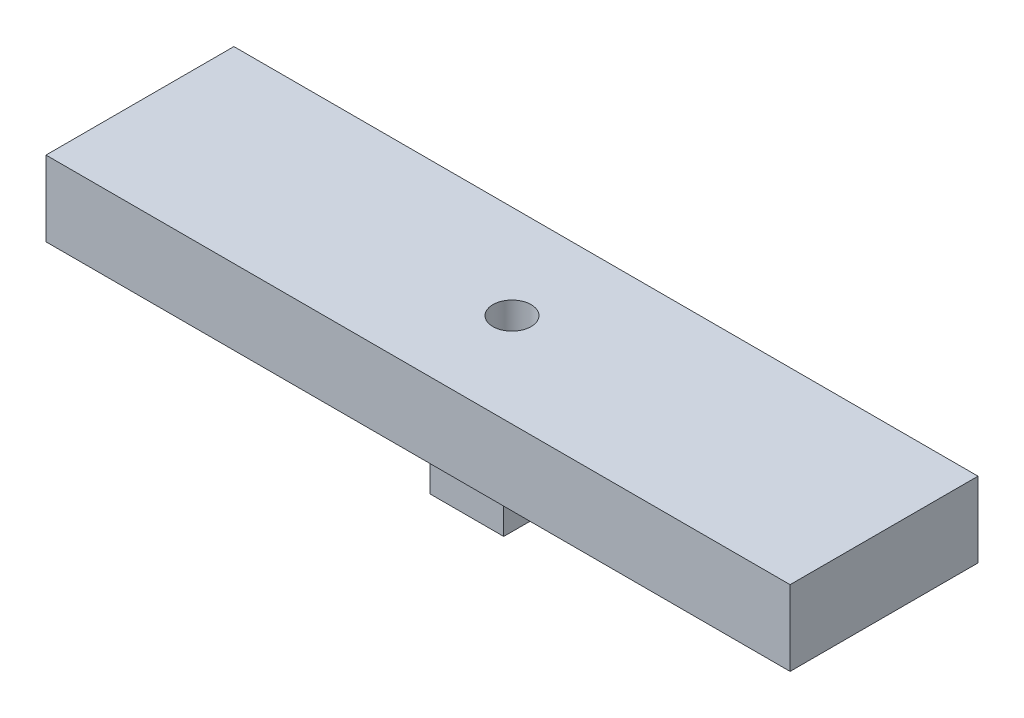
ISO-10303-21;
HEADER;
FILE_DESCRIPTION(('STEP AP214'),'2;1');
FILE_NAME('part.step','',(''),(''),'','','');
FILE_SCHEMA(('AUTOMOTIVE_DESIGN { 1 0 10303 214 1 1 1 1 }'));
ENDSEC;
DATA;
#1=APPLICATION_CONTEXT('core data for automotive mechanical design processes');
#2=APPLICATION_PROTOCOL_DEFINITION('international standard','automotive_design',2000,#1);
#3=PRODUCT_CONTEXT('',#1,'mechanical');
#4=PRODUCT('Part','Part','',(#3));
#5=PRODUCT_RELATED_PRODUCT_CATEGORY('part','',(#4));
#6=PRODUCT_DEFINITION_FORMATION('','',#4);
#7=PRODUCT_DEFINITION_CONTEXT('part definition',#1,'design');
#8=PRODUCT_DEFINITION('design','',#6,#7);
#9=PRODUCT_DEFINITION_SHAPE('','',#8);
#10=(LENGTH_UNIT() NAMED_UNIT(*) SI_UNIT(.MILLI.,.METRE.));
#11=(NAMED_UNIT(*) PLANE_ANGLE_UNIT() SI_UNIT($,.RADIAN.));
#12=(NAMED_UNIT(*) SI_UNIT($,.STERADIAN.) SOLID_ANGLE_UNIT());
#13=UNCERTAINTY_MEASURE_WITH_UNIT(LENGTH_MEASURE(1.E-05),#10,'distance_accuracy_value','');
#14=(GEOMETRIC_REPRESENTATION_CONTEXT(3) GLOBAL_UNCERTAINTY_ASSIGNED_CONTEXT((#13)) GLOBAL_UNIT_ASSIGNED_CONTEXT((#10,
#11,#12)) REPRESENTATION_CONTEXT('',''));
#15=CARTESIAN_POINT('',(0.,0.,0.));
#16=DIRECTION('',(0.,0.,1.));
#17=DIRECTION('',(1.,0.,0.));
#18=AXIS2_PLACEMENT_3D('',#15,#16,#17);
#19=CARTESIAN_POINT('',(0.,0.,0.));
#20=DIRECTION('',(0.,1.,0.));
#21=DIRECTION('',(0.,0.,1.));
#22=AXIS2_PLACEMENT_3D('',#19,#20,#21);
#23=PLANE('',#22);
#24=DIRECTION('',(1.,0.,0.));
#25=VECTOR('',#24,1.);
#26=CARTESIAN_POINT('',(-49.5,0.,12.5));
#27=LINE('',#26,#25);
#28=CARTESIAN_POINT('',(-49.5,0.,12.5));
#29=VERTEX_POINT('',#28);
#30=CARTESIAN_POINT('',(49.5,0.,12.5));
#31=VERTEX_POINT('',#30);
#32=EDGE_CURVE('E119',#29,#31,#27,.T.);
#33=ORIENTED_EDGE('',*,*,#32,.F.);
#34=DIRECTION('',(0.,0.,1.));
#35=VECTOR('',#34,1.);
#36=CARTESIAN_POINT('',(-49.5,0.,12.5));
#37=LINE('',#36,#35);
#38=CARTESIAN_POINT('',(-49.5,0.,-12.5));
#39=VERTEX_POINT('',#38);
#40=EDGE_CURVE('E132',#39,#29,#37,.T.);
#41=ORIENTED_EDGE('',*,*,#40,.F.);
#42=DIRECTION('',(-1.,0.,0.));
#43=VECTOR('',#42,1.);
#44=CARTESIAN_POINT('',(-49.5,0.,-12.5));
#45=LINE('',#44,#43);
#46=CARTESIAN_POINT('',(49.5,0.,-12.5));
#47=VERTEX_POINT('',#46);
#48=EDGE_CURVE('E140',#47,#39,#45,.T.);
#49=ORIENTED_EDGE('',*,*,#48,.F.);
#50=DIRECTION('',(0.,0.,-1.));
#51=VECTOR('',#50,1.);
#52=CARTESIAN_POINT('',(49.5,0.,12.5));
#53=LINE('',#52,#51);
#54=EDGE_CURVE('E122',#31,#47,#53,.T.);
#55=ORIENTED_EDGE('',*,*,#54,.F.);
#56=EDGE_LOOP('',(#33,#41,#49,#55));
#57=FACE_BOUND('',#56,.T.);
#58=DIRECTION('',(0.,0.,1.));
#59=VECTOR('',#58,1.);
#60=CARTESIAN_POINT('',(4.9,0.,6.));
#61=LINE('',#60,#59);
#62=CARTESIAN_POINT('',(4.9,0.,-6.));
#63=VERTEX_POINT('',#62);
#64=CARTESIAN_POINT('',(4.9,0.,6.));
#65=VERTEX_POINT('',#64);
#66=EDGE_CURVE('E118',#63,#65,#61,.T.);
#67=ORIENTED_EDGE('',*,*,#66,.F.);
#68=DIRECTION('',(1.,0.,0.));
#69=VECTOR('',#68,1.);
#70=CARTESIAN_POINT('',(-4.9,0.,-6.));
#71=LINE('',#70,#69);
#72=CARTESIAN_POINT('',(-4.9,0.,-6.));
#73=VERTEX_POINT('',#72);
#74=EDGE_CURVE('E115',#73,#63,#71,.T.);
#75=ORIENTED_EDGE('',*,*,#74,.F.);
#76=DIRECTION('',(0.,0.,-1.));
#77=VECTOR('',#76,1.);
#78=CARTESIAN_POINT('',(-4.9,0.,6.));
#79=LINE('',#78,#77);
#80=CARTESIAN_POINT('',(-4.9,0.,6.));
#81=VERTEX_POINT('',#80);
#82=EDGE_CURVE('E53',#81,#73,#79,.T.);
#83=ORIENTED_EDGE('',*,*,#82,.F.);
#84=DIRECTION('',(-1.,0.,0.));
#85=VECTOR('',#84,1.);
#86=CARTESIAN_POINT('',(-4.9,0.,6.));
#87=LINE('',#86,#85);
#88=EDGE_CURVE('E48',#65,#81,#87,.T.);
#89=ORIENTED_EDGE('',*,*,#88,.F.);
#90=EDGE_LOOP('',(#67,#75,#83,#89));
#91=FACE_BOUND('',#90,.T.);
#92=ADVANCED_FACE('F32',(#57,#91),#23,.F.);
#93=CARTESIAN_POINT('',(-49.5,10.,12.5));
#94=DIRECTION('',(0.,0.,-1.));
#95=DIRECTION('',(-1.,0.,0.));
#96=AXIS2_PLACEMENT_3D('',#93,#94,#95);
#97=PLANE('',#96);
#98=ORIENTED_EDGE('',*,*,#32,.T.);
#99=DIRECTION('',(0.,-1.,0.));
#100=VECTOR('',#99,1.);
#101=CARTESIAN_POINT('',(49.5,10.,12.5));
#102=LINE('',#101,#100);
#103=CARTESIAN_POINT('',(49.5,10.,12.5));
#104=VERTEX_POINT('',#103);
#105=EDGE_CURVE('E11',#104,#31,#102,.T.);
#106=ORIENTED_EDGE('',*,*,#105,.F.);
#107=DIRECTION('',(1.,0.,0.));
#108=VECTOR('',#107,1.);
#109=CARTESIAN_POINT('',(-49.5,10.,12.5));
#110=LINE('',#109,#108);
#111=CARTESIAN_POINT('',(-49.5,10.,12.5));
#112=VERTEX_POINT('',#111);
#113=EDGE_CURVE('E128',#112,#104,#110,.T.);
#114=ORIENTED_EDGE('',*,*,#113,.F.);
#115=DIRECTION('',(0.,-1.,0.));
#116=VECTOR('',#115,1.);
#117=CARTESIAN_POINT('',(-49.5,10.,12.5));
#118=LINE('',#117,#116);
#119=EDGE_CURVE('E137',#112,#29,#118,.T.);
#120=ORIENTED_EDGE('',*,*,#119,.T.);
#121=EDGE_LOOP('',(#98,#106,#114,#120));
#122=FACE_BOUND('',#121,.T.);
#123=ADVANCED_FACE('F34',(#122),#97,.F.);
#124=CARTESIAN_POINT('',(49.5,10.,12.5));
#125=DIRECTION('',(-1.,0.,0.));
#126=DIRECTION('',(0.,0.,1.));
#127=AXIS2_PLACEMENT_3D('',#124,#125,#126);
#128=PLANE('',#127);
#129=ORIENTED_EDGE('',*,*,#54,.T.);
#130=DIRECTION('',(0.,-1.,0.));
#131=VECTOR('',#130,1.);
#132=CARTESIAN_POINT('',(49.5,10.,-12.5));
#133=LINE('',#132,#131);
#134=CARTESIAN_POINT('',(49.5,10.,-12.5));
#135=VERTEX_POINT('',#134);
#136=EDGE_CURVE('E41',#135,#47,#133,.T.);
#137=ORIENTED_EDGE('',*,*,#136,.F.);
#138=DIRECTION('',(0.,0.,-1.));
#139=VECTOR('',#138,1.);
#140=CARTESIAN_POINT('',(49.5,10.,12.5));
#141=LINE('',#140,#139);
#142=EDGE_CURVE('E131',#104,#135,#141,.T.);
#143=ORIENTED_EDGE('',*,*,#142,.F.);
#144=ORIENTED_EDGE('',*,*,#105,.T.);
#145=EDGE_LOOP('',(#129,#137,#143,#144));
#146=FACE_BOUND('',#145,.T.);
#147=ADVANCED_FACE('F168',(#146),#128,.F.);
#148=CARTESIAN_POINT('',(-49.5,10.,-12.5));
#149=DIRECTION('',(0.,0.,1.));
#150=DIRECTION('',(1.,0.,0.));
#151=AXIS2_PLACEMENT_3D('',#148,#149,#150);
#152=PLANE('',#151);
#153=ORIENTED_EDGE('',*,*,#48,.T.);
#154=DIRECTION('',(0.,-1.,0.));
#155=VECTOR('',#154,1.);
#156=CARTESIAN_POINT('',(-49.5,10.,-12.5));
#157=LINE('',#156,#155);
#158=CARTESIAN_POINT('',(-49.5,10.,-12.5));
#159=VERTEX_POINT('',#158);
#160=EDGE_CURVE('E145',#159,#39,#157,.T.);
#161=ORIENTED_EDGE('',*,*,#160,.F.);
#162=DIRECTION('',(-1.,0.,0.));
#163=VECTOR('',#162,1.);
#164=CARTESIAN_POINT('',(-49.5,10.,-12.5));
#165=LINE('',#164,#163);
#166=EDGE_CURVE('E134',#135,#159,#165,.T.);
#167=ORIENTED_EDGE('',*,*,#166,.F.);
#168=ORIENTED_EDGE('',*,*,#136,.T.);
#169=EDGE_LOOP('',(#153,#161,#167,#168));
#170=FACE_BOUND('',#169,.T.);
#171=ADVANCED_FACE('F153',(#170),#152,.F.);
#172=CARTESIAN_POINT('',(-49.5,10.,12.5));
#173=DIRECTION('',(1.,0.,0.));
#174=DIRECTION('',(0.,0.,-1.));
#175=AXIS2_PLACEMENT_3D('',#172,#173,#174);
#176=PLANE('',#175);
#177=ORIENTED_EDGE('',*,*,#40,.T.);
#178=ORIENTED_EDGE('',*,*,#119,.F.);
#179=DIRECTION('',(0.,0.,1.));
#180=VECTOR('',#179,1.);
#181=CARTESIAN_POINT('',(-49.5,10.,12.5));
#182=LINE('',#181,#180);
#183=EDGE_CURVE('E136',#159,#112,#182,.T.);
#184=ORIENTED_EDGE('',*,*,#183,.F.);
#185=ORIENTED_EDGE('',*,*,#160,.T.);
#186=EDGE_LOOP('',(#177,#178,#184,#185));
#187=FACE_BOUND('',#186,.T.);
#188=ADVANCED_FACE('F161',(#187),#176,.F.);
#189=CARTESIAN_POINT('',(0.,10.,0.));
#190=DIRECTION('',(0.,1.,0.));
#191=DIRECTION('',(0.,0.,1.));
#192=AXIS2_PLACEMENT_3D('',#189,#190,#191);
#193=PLANE('',#192);
#194=CARTESIAN_POINT('',(0.,10.,0.));
#195=DIRECTION('',(0.,1.,0.));
#196=DIRECTION('',(0.,0.,1.));
#197=AXIS2_PLACEMENT_3D('',#194,#195,#196);
#198=CIRCLE('',#197,2.54);
#199=CARTESIAN_POINT('',(0.,10.,2.54));
#200=VERTEX_POINT('',#199);
#201=EDGE_CURVE('E195',#200,#200,#198,.T.);
#202=ORIENTED_EDGE('',*,*,#201,.F.);
#203=EDGE_LOOP('',(#202));
#204=FACE_BOUND('',#203,.T.);
#205=ORIENTED_EDGE('',*,*,#113,.T.);
#206=ORIENTED_EDGE('',*,*,#142,.T.);
#207=ORIENTED_EDGE('',*,*,#166,.T.);
#208=ORIENTED_EDGE('',*,*,#183,.T.);
#209=EDGE_LOOP('',(#205,#206,#207,#208));
#210=FACE_BOUND('',#209,.T.);
#211=ADVANCED_FACE('F167',(#204,#210),#193,.T.);
#212=CARTESIAN_POINT('',(4.9,-10.,6.));
#213=DIRECTION('',(-1.,0.,0.));
#214=DIRECTION('',(0.,0.,1.));
#215=AXIS2_PLACEMENT_3D('',#212,#213,#214);
#216=PLANE('',#215);
#217=CARTESIAN_POINT('',(4.9,-6.,0.));
#218=DIRECTION('',(1.,0.,0.));
#219=DIRECTION('',(0.,0.,-1.));
#220=AXIS2_PLACEMENT_3D('',#217,#218,#219);
#221=CIRCLE('',#220,2.05);
#222=CARTESIAN_POINT('',(4.9,-6.,-2.05));
#223=VERTEX_POINT('',#222);
#224=EDGE_CURVE('E202',#223,#223,#221,.T.);
#225=ORIENTED_EDGE('',*,*,#224,.F.);
#226=EDGE_LOOP('',(#225));
#227=FACE_BOUND('',#226,.T.);
#228=ORIENTED_EDGE('',*,*,#66,.T.);
#229=DIRECTION('',(0.,1.,0.));
#230=VECTOR('',#229,1.);
#231=CARTESIAN_POINT('',(4.9,-10.,6.));
#232=LINE('',#231,#230);
#233=CARTESIAN_POINT('',(4.9,-10.,6.));
#234=VERTEX_POINT('',#233);
#235=EDGE_CURVE('E99',#234,#65,#232,.T.);
#236=ORIENTED_EDGE('',*,*,#235,.F.);
#237=DIRECTION('',(0.,0.,1.));
#238=VECTOR('',#237,1.);
#239=CARTESIAN_POINT('',(4.9,-10.,6.));
#240=LINE('',#239,#238);
#241=CARTESIAN_POINT('',(4.9,-10.,-6.));
#242=VERTEX_POINT('',#241);
#243=EDGE_CURVE('E106',#242,#234,#240,.T.);
#244=ORIENTED_EDGE('',*,*,#243,.F.);
#245=DIRECTION('',(0.,1.,0.));
#246=VECTOR('',#245,1.);
#247=CARTESIAN_POINT('',(4.9,-10.,-6.));
#248=LINE('',#247,#246);
#249=EDGE_CURVE('E207',#242,#63,#248,.T.);
#250=ORIENTED_EDGE('',*,*,#249,.T.);
#251=EDGE_LOOP('',(#228,#236,#244,#250));
#252=FACE_BOUND('',#251,.T.);
#253=ADVANCED_FACE('F117',(#227,#252),#216,.F.);
#254=CARTESIAN_POINT('',(-4.9,-10.,6.));
#255=DIRECTION('',(0.,0.,-1.));
#256=DIRECTION('',(-1.,0.,0.));
#257=AXIS2_PLACEMENT_3D('',#254,#255,#256);
#258=PLANE('',#257);
#259=ORIENTED_EDGE('',*,*,#88,.T.);
#260=DIRECTION('',(0.,1.,0.));
#261=VECTOR('',#260,1.);
#262=CARTESIAN_POINT('',(-4.9,-10.,6.));
#263=LINE('',#262,#261);
#264=CARTESIAN_POINT('',(-4.9,-10.,6.));
#265=VERTEX_POINT('',#264);
#266=EDGE_CURVE('E102',#265,#81,#263,.T.);
#267=ORIENTED_EDGE('',*,*,#266,.F.);
#268=DIRECTION('',(-1.,0.,0.));
#269=VECTOR('',#268,1.);
#270=CARTESIAN_POINT('',(-4.9,-10.,6.));
#271=LINE('',#270,#269);
#272=EDGE_CURVE('E95',#234,#265,#271,.T.);
#273=ORIENTED_EDGE('',*,*,#272,.F.);
#274=ORIENTED_EDGE('',*,*,#235,.T.);
#275=EDGE_LOOP('',(#259,#267,#273,#274));
#276=FACE_BOUND('',#275,.T.);
#277=ADVANCED_FACE('F97',(#276),#258,.F.);
#278=CARTESIAN_POINT('',(-4.9,-10.,6.));
#279=DIRECTION('',(1.,0.,0.));
#280=DIRECTION('',(0.,0.,-1.));
#281=AXIS2_PLACEMENT_3D('',#278,#279,#280);
#282=PLANE('',#281);
#283=CARTESIAN_POINT('',(-4.9,-6.,0.));
#284=DIRECTION('',(1.,0.,0.));
#285=DIRECTION('',(0.,0.,-1.));
#286=AXIS2_PLACEMENT_3D('',#283,#284,#285);
#287=CIRCLE('',#286,2.05);
#288=CARTESIAN_POINT('',(-4.9,-6.,-2.05));
#289=VERTEX_POINT('',#288);
#290=EDGE_CURVE('E36',#289,#289,#287,.T.);
#291=ORIENTED_EDGE('',*,*,#290,.T.);
#292=EDGE_LOOP('',(#291));
#293=FACE_BOUND('',#292,.T.);
#294=ORIENTED_EDGE('',*,*,#82,.T.);
#295=DIRECTION('',(0.,1.,0.));
#296=VECTOR('',#295,1.);
#297=CARTESIAN_POINT('',(-4.9,-10.,-6.));
#298=LINE('',#297,#296);
#299=CARTESIAN_POINT('',(-4.9,-10.,-6.));
#300=VERTEX_POINT('',#299);
#301=EDGE_CURVE('E124',#300,#73,#298,.T.);
#302=ORIENTED_EDGE('',*,*,#301,.F.);
#303=DIRECTION('',(0.,0.,-1.));
#304=VECTOR('',#303,1.);
#305=CARTESIAN_POINT('',(-4.9,-10.,6.));
#306=LINE('',#305,#304);
#307=EDGE_CURVE('E105',#265,#300,#306,.T.);
#308=ORIENTED_EDGE('',*,*,#307,.F.);
#309=ORIENTED_EDGE('',*,*,#266,.T.);
#310=EDGE_LOOP('',(#294,#302,#308,#309));
#311=FACE_BOUND('',#310,.T.);
#312=ADVANCED_FACE('F218',(#293,#311),#282,.F.);
#313=CARTESIAN_POINT('',(-4.9,-10.,-6.));
#314=DIRECTION('',(0.,0.,1.));
#315=DIRECTION('',(1.,0.,0.));
#316=AXIS2_PLACEMENT_3D('',#313,#314,#315);
#317=PLANE('',#316);
#318=ORIENTED_EDGE('',*,*,#74,.T.);
#319=ORIENTED_EDGE('',*,*,#249,.F.);
#320=DIRECTION('',(1.,0.,0.));
#321=VECTOR('',#320,1.);
#322=CARTESIAN_POINT('',(-4.9,-10.,-6.));
#323=LINE('',#322,#321);
#324=EDGE_CURVE('E111',#300,#242,#323,.T.);
#325=ORIENTED_EDGE('',*,*,#324,.F.);
#326=ORIENTED_EDGE('',*,*,#301,.T.);
#327=EDGE_LOOP('',(#318,#319,#325,#326));
#328=FACE_BOUND('',#327,.T.);
#329=ADVANCED_FACE('F216',(#328),#317,.F.);
#330=CARTESIAN_POINT('',(0.,-10.,0.));
#331=DIRECTION('',(0.,-1.,0.));
#332=DIRECTION('',(0.,0.,-1.));
#333=AXIS2_PLACEMENT_3D('',#330,#331,#332);
#334=PLANE('',#333);
#335=ORIENTED_EDGE('',*,*,#243,.T.);
#336=ORIENTED_EDGE('',*,*,#272,.T.);
#337=ORIENTED_EDGE('',*,*,#307,.T.);
#338=ORIENTED_EDGE('',*,*,#324,.T.);
#339=EDGE_LOOP('',(#335,#336,#337,#338));
#340=FACE_BOUND('',#339,.T.);
#341=ADVANCED_FACE('F109',(#340),#334,.T.);
#342=CARTESIAN_POINT('',(0.,4.78,0.));
#343=DIRECTION('',(0.,1.,0.));
#344=DIRECTION('',(0.,0.,1.));
#345=AXIS2_PLACEMENT_3D('',#342,#343,#344);
#346=CYLINDRICAL_SURFACE('',#345,2.54);
#347=CARTESIAN_POINT('',(0.,4.78,0.));
#348=DIRECTION('',(0.,1.,0.));
#349=DIRECTION('',(0.,0.,1.));
#350=AXIS2_PLACEMENT_3D('',#347,#348,#349);
#351=CIRCLE('',#350,2.54);
#352=CARTESIAN_POINT('',(0.,4.78,2.54));
#353=VERTEX_POINT('',#352);
#354=EDGE_CURVE('E197',#353,#353,#351,.T.);
#355=ORIENTED_EDGE('',*,*,#354,.F.);
#356=EDGE_LOOP('',(#355));
#357=FACE_BOUND('',#356,.T.);
#358=ORIENTED_EDGE('',*,*,#201,.T.);
#359=EDGE_LOOP('',(#358));
#360=FACE_BOUND('',#359,.T.);
#361=ADVANCED_FACE('F232',(#357,#360),#346,.F.);
#362=CARTESIAN_POINT('',(0.,4.78,0.));
#363=DIRECTION('',(0.,1.,0.));
#364=DIRECTION('',(0.,0.,1.));
#365=AXIS2_PLACEMENT_3D('',#362,#363,#364);
#366=PLANE('',#365);
#367=ORIENTED_EDGE('',*,*,#354,.T.);
#368=EDGE_LOOP('',(#367));
#369=FACE_BOUND('',#368,.T.);
#370=ADVANCED_FACE('F235',(#369),#366,.T.);
#371=CARTESIAN_POINT('',(-5.1,-6.,0.));
#372=DIRECTION('',(1.,0.,0.));
#373=DIRECTION('',(0.,0.,-1.));
#374=AXIS2_PLACEMENT_3D('',#371,#372,#373);
#375=CYLINDRICAL_SURFACE('',#374,2.05);
#376=ORIENTED_EDGE('',*,*,#224,.T.);
#377=EDGE_LOOP('',(#376));
#378=FACE_BOUND('',#377,.T.);
#379=ORIENTED_EDGE('',*,*,#290,.F.);
#380=EDGE_LOOP('',(#379));
#381=FACE_BOUND('',#380,.T.);
#382=ADVANCED_FACE('F239',(#378,#381),#375,.F.);
#383=CLOSED_SHELL('',(#92,#123,#147,#171,#188,#211,#253,#277,#312,#329,#341,#361,#370,#382));
#384=MANIFOLD_SOLID_BREP('B2',#383);
#385=ADVANCED_BREP_SHAPE_REPRESENTATION('',(#18,#384),#14);
#386=SHAPE_DEFINITION_REPRESENTATION(#9,#385);
ENDSEC;
END-ISO-10303-21;
